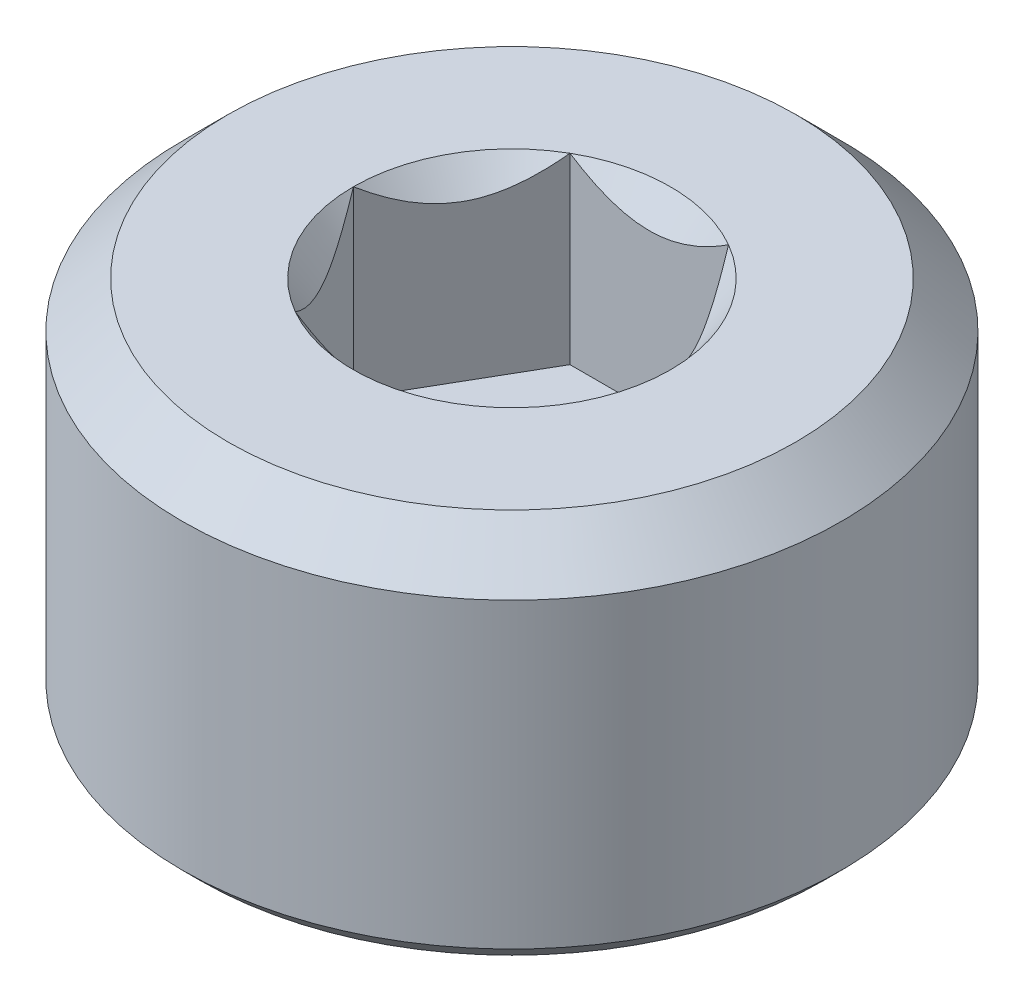
ISO-10303-21;
HEADER;
FILE_DESCRIPTION(('STEP AP214'),'2;1');
FILE_NAME('part.step','',(''),(''),'','','');
FILE_SCHEMA(('AUTOMOTIVE_DESIGN { 1 0 10303 214 1 1 1 1 }'));
ENDSEC;
DATA;
#1=APPLICATION_CONTEXT('core data for automotive mechanical design processes');
#2=APPLICATION_PROTOCOL_DEFINITION('international standard','automotive_design',2000,#1);
#3=PRODUCT_CONTEXT('',#1,'mechanical');
#4=PRODUCT('Part','Part','',(#3));
#5=PRODUCT_RELATED_PRODUCT_CATEGORY('part','',(#4));
#6=PRODUCT_DEFINITION_FORMATION('','',#4);
#7=PRODUCT_DEFINITION_CONTEXT('part definition',#1,'design');
#8=PRODUCT_DEFINITION('design','',#6,#7);
#9=PRODUCT_DEFINITION_SHAPE('','',#8);
#10=(LENGTH_UNIT() NAMED_UNIT(*) SI_UNIT(.MILLI.,.METRE.));
#11=(NAMED_UNIT(*) PLANE_ANGLE_UNIT() SI_UNIT($,.RADIAN.));
#12=(NAMED_UNIT(*) SI_UNIT($,.STERADIAN.) SOLID_ANGLE_UNIT());
#13=UNCERTAINTY_MEASURE_WITH_UNIT(LENGTH_MEASURE(1.E-05),#10,'distance_accuracy_value','');
#14=(GEOMETRIC_REPRESENTATION_CONTEXT(3) GLOBAL_UNCERTAINTY_ASSIGNED_CONTEXT((#13)) GLOBAL_UNIT_ASSIGNED_CONTEXT((#10,
#11,#12)) REPRESENTATION_CONTEXT('',''));
#15=CARTESIAN_POINT('',(0.,0.,0.));
#16=DIRECTION('',(0.,0.,1.));
#17=DIRECTION('',(1.,0.,0.));
#18=AXIS2_PLACEMENT_3D('',#15,#16,#17);
#19=CARTESIAN_POINT('',(0.,4.,0.));
#20=DIRECTION('',(0.,-1.,0.));
#21=DIRECTION('',(0.,0.,-1.));
#22=AXIS2_PLACEMENT_3D('',#19,#20,#21);
#23=CYLINDRICAL_SURFACE('',#22,3.6);
#24=CARTESIAN_POINT('',(0.,0.2,0.));
#25=DIRECTION('',(0.,1.,0.));
#26=DIRECTION('',(0.,0.,1.));
#27=AXIS2_PLACEMENT_3D('',#24,#25,#26);
#28=CIRCLE('',#27,3.6);
#29=CARTESIAN_POINT('',(0.,0.2,3.6));
#30=VERTEX_POINT('',#29);
#31=EDGE_CURVE('E49',#30,#30,#28,.T.);
#32=ORIENTED_EDGE('',*,*,#31,.T.);
#33=EDGE_LOOP('',(#32));
#34=FACE_BOUND('',#33,.T.);
#35=CARTESIAN_POINT('',(0.,3.5,0.));
#36=DIRECTION('',(0.,1.,0.));
#37=DIRECTION('',(0.,0.,1.));
#38=AXIS2_PLACEMENT_3D('',#35,#36,#37);
#39=CIRCLE('',#38,3.6);
#40=CARTESIAN_POINT('',(0.,3.5,3.6));
#41=VERTEX_POINT('',#40);
#42=EDGE_CURVE('E482',#41,#41,#39,.F.);
#43=ORIENTED_EDGE('',*,*,#42,.T.);
#44=EDGE_LOOP('',(#43));
#45=FACE_BOUND('',#44,.T.);
#46=ADVANCED_FACE('F40',(#34,#45),#23,.T.);
#47=CARTESIAN_POINT('',(0.,4.,0.));
#48=DIRECTION('',(0.,1.,0.));
#49=DIRECTION('',(0.,0.,1.));
#50=AXIS2_PLACEMENT_3D('',#47,#48,#49);
#51=PLANE('',#50);
#52=CARTESIAN_POINT('',(0.,4.,0.));
#53=DIRECTION('',(0.,1.,0.));
#54=DIRECTION('',(0.,0.,1.));
#55=AXIS2_PLACEMENT_3D('',#52,#53,#54);
#56=CIRCLE('',#55,3.1);
#57=CARTESIAN_POINT('',(0.,4.,3.1));
#58=VERTEX_POINT('',#57);
#59=EDGE_CURVE('E155',#58,#58,#56,.T.);
#60=ORIENTED_EDGE('',*,*,#59,.T.);
#61=EDGE_LOOP('',(#60));
#62=FACE_BOUND('',#61,.T.);
#63=CARTESIAN_POINT('',(0.,4.,0.));
#64=DIRECTION('',(0.,1.,0.));
#65=DIRECTION('',(0.,0.,1.));
#66=AXIS2_PLACEMENT_3D('',#63,#64,#65);
#67=CIRCLE('',#66,1.73205080756888);
#68=CARTESIAN_POINT('',(0.86602663305117,4.,1.50000212826788));
#69=VERTEX_POINT('',#68);
#70=CARTESIAN_POINT('',(1.73205080756888,4.,0.));
#71=VERTEX_POINT('',#70);
#72=EDGE_CURVE('E126',#69,#71,#67,.T.);
#73=ORIENTED_EDGE('',*,*,#72,.F.);
#74=CARTESIAN_POINT('',(-0.866025403784438,4.,1.5));
#75=VERTEX_POINT('',#74);
#76=EDGE_CURVE('E260',#75,#69,#67,.T.);
#77=ORIENTED_EDGE('',*,*,#76,.F.);
#78=CARTESIAN_POINT('',(-1.73205080756888,4.,0.));
#79=VERTEX_POINT('',#78);
#80=EDGE_CURVE('E257',#79,#75,#67,.T.);
#81=ORIENTED_EDGE('',*,*,#80,.F.);
#82=CARTESIAN_POINT('',(-0.866026633051167,4.,-1.50000212826789));
#83=VERTEX_POINT('',#82);
#84=EDGE_CURVE('E64',#83,#79,#67,.T.);
#85=ORIENTED_EDGE('',*,*,#84,.F.);
#86=CARTESIAN_POINT('',(0.866024628980088,4.,-1.49999865724289));
#87=VERTEX_POINT('',#86);
#88=EDGE_CURVE('E178',#87,#83,#67,.T.);
#89=ORIENTED_EDGE('',*,*,#88,.F.);
#90=EDGE_CURVE('E141',#71,#87,#67,.T.);
#91=ORIENTED_EDGE('',*,*,#90,.F.);
#92=EDGE_LOOP('',(#73,#77,#81,#85,#89,#91));
#93=FACE_BOUND('',#92,.T.);
#94=ADVANCED_FACE('F177',(#62,#93),#51,.T.);
#95=CARTESIAN_POINT('',(0.,0.,0.));
#96=DIRECTION('',(0.,1.,0.));
#97=DIRECTION('',(0.,0.,1.));
#98=AXIS2_PLACEMENT_3D('',#95,#96,#97);
#99=PLANE('',#98);
#100=CARTESIAN_POINT('',(0.,0.,0.));
#101=DIRECTION('',(0.,1.,0.));
#102=DIRECTION('',(0.,0.,1.));
#103=AXIS2_PLACEMENT_3D('',#100,#101,#102);
#104=CIRCLE('',#103,3.4);
#105=CARTESIAN_POINT('',(0.,0.,3.4));
#106=VERTEX_POINT('',#105);
#107=EDGE_CURVE('E12',#106,#106,#104,.F.);
#108=ORIENTED_EDGE('',*,*,#107,.T.);
#109=EDGE_LOOP('',(#108));
#110=FACE_BOUND('',#109,.T.);
#111=ADVANCED_FACE('F198',(#110),#99,.F.);
#112=CARTESIAN_POINT('',(0.,3.7,0.));
#113=DIRECTION('',(0.,1.,0.));
#114=DIRECTION('',(0.,0.,1.));
#115=AXIS2_PLACEMENT_3D('',#112,#113,#114);
#116=CONICAL_SURFACE('',#115,1.5,0.658373937780635);
#117=ORIENTED_EDGE('',*,*,#90,.T.);
#118=CARTESIAN_POINT('',(1.73216627762271,4.00014929695951,0.000200000000000189));
#119=CARTESIAN_POINT('',(1.68470317304455,3.9387948104205,-0.0820085086143397));
#120=CARTESIAN_POINT('',(1.63468238723343,3.8815734535091,-0.168647051073716));
#121=CARTESIAN_POINT('',(1.52986120222608,3.78577671769678,-0.350202669216024));
#122=CARTESIAN_POINT('',(1.47501566024014,3.747405945603,-0.445197934504332));
#123=CARTESIAN_POINT('',(1.38424170870309,3.71052819306535,-0.60242303057029));
#124=CARTESIAN_POINT('',(1.34938951234473,3.70226526358055,-0.662788805418339));
#125=CARTESIAN_POINT('',(1.27977360016166,3.69856750205182,-0.783367102334667));
#126=CARTESIAN_POINT('',(1.24501110944695,3.70303905086789,-0.843577502450194));
#127=CARTESIAN_POINT('',(1.17658203271347,3.72371306708084,-0.962100140067606));
#128=CARTESIAN_POINT('',(1.14291102856452,3.73985975920638,-1.02042002999544));
#129=CARTESIAN_POINT('',(1.07687692082179,3.78157585767296,-1.13479445963833));
#130=CARTESIAN_POINT('',(1.04452372874817,3.8072057638297,-1.19083183209688));
#131=CARTESIAN_POINT('',(0.987325509444635,3.85990139574927,-1.28990205403307));
#132=CARTESIAN_POINT('',(0.962204666115238,3.88580995159191,-1.33341263100856));
#133=CARTESIAN_POINT('',(0.913223874934007,3.94081643100068,-1.41824984992937));
#134=CARTESIAN_POINT('',(0.889352762705577,3.96987432622318,-1.45959582914219));
#135=CARTESIAN_POINT('',(0.8659099337306,4.00014929695951,-1.5002));
#136=B_SPLINE_CURVE_WITH_KNOTS('',3,(#118,#119,#120,#121,#122,#123,#124,#125,#126,#127,#128,
#129,#130,#131,#132,#133,#134,#135),.UNSPECIFIED.,.F.,.F.,(4,2,2,2,2,2,2,2,4),(0.,
0.342302497442157,0.688242536879981,0.897661003376357,1.1055438862815,1.31244016387057,
1.5206797934228,1.6901220695248,1.85761915263013),.UNSPECIFIED.);
#137=CARTESIAN_POINT('',(1.29893397721988,3.70000001869028,-0.75018035577766));
#138=VERTEX_POINT('',#137);
#139=EDGE_CURVE('E156',#138,#87,#136,.T.);
#140=ORIENTED_EDGE('',*,*,#139,.F.);
#141=CARTESIAN_POINT('',(1.29903810567666,3.7,-0.75));
#142=DIRECTION('',(-0.499999997986311,8.97462545794012E-05,-0.866025400296838));
#143=VECTOR('',#142,1.);
#144=LINE('',#141,#143);
#145=CARTESIAN_POINT('',(1.29903669948382,3.7,-0.74999918865121));
#146=VERTEX_POINT('',#145);
#147=EDGE_CURVE('E151',#146,#138,#144,.T.);
#148=ORIENTED_EDGE('',*,*,#147,.F.);
#149=EDGE_CURVE('E146',#71,#146,#136,.T.);
#150=ORIENTED_EDGE('',*,*,#149,.F.);
#151=EDGE_LOOP('',(#117,#140,#148,#150));
#152=FACE_BOUND('',#151,.T.);
#153=ADVANCED_FACE('F147',(#152),#116,.F.);
#154=CARTESIAN_POINT('',(0.,3.7,0.));
#155=DIRECTION('',(0.,1.,0.));
#156=DIRECTION('',(0.,0.,1.));
#157=AXIS2_PLACEMENT_3D('',#154,#155,#156);
#158=CIRCLE('',#157,1.5);
#159=CARTESIAN_POINT('',(0.00053913890151861,3.7,-1.50000000097464));
#160=VERTEX_POINT('',#159);
#161=CARTESIAN_POINT('',(0.,3.7,-1.5));
#162=VERTEX_POINT('',#161);
#163=EDGE_CURVE('E278',#160,#162,#158,.T.);
#164=ORIENTED_EDGE('',*,*,#163,.F.);
#165=CARTESIAN_POINT('',(2.62408205607438,5.66838318386751,-1.5));
#166=CARTESIAN_POINT('',(2.5722518577941,5.61021425048297,-1.5));
#167=CARTESIAN_POINT('',(2.5202152809341,5.55222849979794,-1.5));
#168=CARTESIAN_POINT('',(2.41564440843719,5.43670057582653,-1.5));
#169=CARTESIAN_POINT('',(2.3631100791447,5.37915843301874,-1.5));
#170=CARTESIAN_POINT('',(2.20441944348227,5.20708201281469,-1.5));
#171=CARTESIAN_POINT('',(2.09739478149864,5.09334533018313,-1.5));
#172=CARTESIAN_POINT('',(1.87931703740767,4.86823460080757,-1.5));
#173=CARTESIAN_POINT('',(1.7682412605443,4.75688226216544,-1.5));
#174=CARTESIAN_POINT('',(1.59794242933439,4.59378413765201,-1.5));
#175=CARTESIAN_POINT('',(1.54058532514464,4.54009357922808,-1.5));
#176=CARTESIAN_POINT('',(1.42431632730804,4.43442637655795,-1.5));
#177=CARTESIAN_POINT('',(1.36540464039697,4.38244950646472,-1.5));
#178=CARTESIAN_POINT('',(1.26432245495508,4.29665878446898,-1.5));
#179=CARTESIAN_POINT('',(1.22266635596937,4.26223981114632,-1.5));
#180=CARTESIAN_POINT('',(1.13826254091543,4.19475577603005,-1.5));
#181=CARTESIAN_POINT('',(1.09551476289084,4.16169079135822,-1.5));
#182=CARTESIAN_POINT('',(1.00857689922031,4.09714866220247,-1.5));
#183=CARTESIAN_POINT('',(0.964381943801944,4.06567803931122,-1.5));
#184=CARTESIAN_POINT('',(0.874499239551919,4.00495090754076,-1.5));
#185=CARTESIAN_POINT('',(0.828811821402204,3.97569391289289,-1.5));
#186=CARTESIAN_POINT('',(0.734790424168225,3.91948728482412,-1.5));
#187=CARTESIAN_POINT('',(0.686421995378124,3.89259463826985,-1.5));
#188=CARTESIAN_POINT('',(0.58768073652831,3.84269342313155,-1.5));
#189=CARTESIAN_POINT('',(0.537307497760848,3.81968565159603,-1.5));
#190=CARTESIAN_POINT('',(0.434884122639641,3.77888404103877,-1.5));
#191=CARTESIAN_POINT('',(0.382849261305249,3.76105266272078,-1.5));
#192=CARTESIAN_POINT('',(0.277067712113839,3.7316740192231,-1.5));
#193=CARTESIAN_POINT('',(0.223323088579574,3.72011945922177,-1.5));
#194=CARTESIAN_POINT('',(0.100017901343093,3.7023007127275,-1.5));
#195=CARTESIAN_POINT('',(0.0301036556746294,3.69830606573399,-1.5));
#196=CARTESIAN_POINT('',(-0.109289178624825,3.70304476598226,-1.5));
#197=CARTESIAN_POINT('',(-0.178767462038265,3.71178620643723,-1.5));
#198=CARTESIAN_POINT('',(-0.334483117238332,3.74448727495287,-1.5));
#199=CARTESIAN_POINT('',(-0.419949890691741,3.77203012360789,-1.5));
#200=CARTESIAN_POINT('',(-0.544092564146134,3.82299874608893,-1.5));
#201=CARTESIAN_POINT('',(-0.584897030701747,3.84165797074686,-1.5));
#202=CARTESIAN_POINT('',(-0.665205165020233,3.88159792668045,-1.5));
#203=CARTESIAN_POINT('',(-0.704709071800037,3.90287817281779,-1.5));
#204=CARTESIAN_POINT('',(-0.801120001904702,3.9582327421369,-1.5));
#205=CARTESIAN_POINT('',(-0.85730440538045,3.99355476228028,-1.5));
#206=CARTESIAN_POINT('',(-0.967438802487129,4.06754896703432,-1.5));
#207=CARTESIAN_POINT('',(-1.02138739805114,4.10622320244691,-1.5));
#208=CARTESIAN_POINT('',(-1.12752392819885,4.18612409736657,-1.5));
#209=CARTESIAN_POINT('',(-1.17970793485625,4.2273559375397,-1.5));
#210=CARTESIAN_POINT('',(-1.28253828825219,4.31170128974672,-1.5));
#211=CARTESIAN_POINT('',(-1.33318434347537,4.35481515478571,-1.5));
#212=CARTESIAN_POINT('',(-1.4837612192679,4.48676392960844,-1.5));
#213=CARTESIAN_POINT('',(-1.58177938806796,4.57777617888057,-1.5));
#214=CARTESIAN_POINT('',(-1.77434660705591,4.76340494746786,-1.5));
#215=CARTESIAN_POINT('',(-1.86889453960376,4.85802260830462,-1.5));
#216=CARTESIAN_POINT('',(-2.01918192519602,5.0123882851831,-1.5));
#217=CARTESIAN_POINT('',(-2.07570527444122,5.07137680595849,-1.5));
#218=CARTESIAN_POINT('',(-2.18797031248278,5.19007605649345,-1.5));
#219=CARTESIAN_POINT('',(-2.24371211488562,5.24978667888728,-1.5));
#220=CARTESIAN_POINT('',(-2.35386305315381,5.36905301929963,-1.5));
#221=CARTESIAN_POINT('',(-2.40828014049012,5.4286014079688,-1.5));
#222=CARTESIAN_POINT('',(-2.51656519131121,5.54816304752033,-1.5));
#223=CARTESIAN_POINT('',(-2.57043331504846,5.60817615318445,-1.5));
#224=CARTESIAN_POINT('',(-2.62408205607438,5.66838318386751,-1.5));
#225=B_SPLINE_CURVE_WITH_KNOTS('',3,(#165,#166,#167,#168,#169,#170,#171,#172,#173,#174,#175,
#176,#177,#178,#179,#180,#181,#182,#183,#184,#185,#186,#187,#188,#189,#190,#191,#192,#193,#194,
#195,#196,#197,#198,#199,#200,#201,#202,#203,#204,#205,#206,#207,#208,#209,#210,#211,#212,#213,
#214,#215,#216,#217,#218,#219,#220,#221,#222,#223,#224),.UNSPECIFIED.,.F.,.F.,(4,2,2,2,2,2,2,2,
2,2,2,2,2,2,2,2,2,2,2,2,2,2,2,2,2,2,2,2,2,4),(0.,0.233730546533873,0.46747701119278,
0.935961988573748,1.40767842933203,1.64335066559987,1.87899171744796,2.04107804074456,
2.20317358350466,2.36588600071158,2.52856260737632,2.69445228493054,2.86037595634147,
3.02506443351466,3.18956110055608,3.39845490568512,3.60748151138069,3.87518665338576,
4.00973416267058,4.14425680518656,4.34318219400574,4.54223015116976,4.74169537026261,
4.94119816450207,5.34229740847603,5.74352471858722,5.98861095972509,6.23366119759544,
6.47566007927547,6.71758616783575),.UNSPECIFIED.);
#226=EDGE_CURVE('E166',#87,#160,#225,.T.);
#227=ORIENTED_EDGE('',*,*,#226,.F.);
#228=ORIENTED_EDGE('',*,*,#88,.T.);
#229=EDGE_CURVE('E165',#162,#83,#225,.T.);
#230=ORIENTED_EDGE('',*,*,#229,.F.);
#231=EDGE_LOOP('',(#164,#227,#228,#230));
#232=FACE_BOUND('',#231,.T.);
#233=ADVANCED_FACE('F404',(#232),#116,.F.);
#234=CARTESIAN_POINT('',(-1.29904017043426,3.7,-0.750001192676911));
#235=VERTEX_POINT('',#234);
#236=CARTESIAN_POINT('',(-1.29911967584827,3.7,-0.749863485329857));
#237=VERTEX_POINT('',#236);
#238=EDGE_CURVE('E281',#235,#237,#158,.T.);
#239=ORIENTED_EDGE('',*,*,#238,.F.);
#240=CARTESIAN_POINT('',(-0.865909933730601,4.00014929695951,-1.5002));
#241=CARTESIAN_POINT('',(-0.913373038308768,3.9387948104205,-1.41799149138566));
#242=CARTESIAN_POINT('',(-0.963393824119885,3.8815734535091,-1.33135294892628));
#243=CARTESIAN_POINT('',(-1.06821500912724,3.78577671769678,-1.14979733078398));
#244=CARTESIAN_POINT('',(-1.12306055111318,3.747405945603,-1.05480206549567));
#245=CARTESIAN_POINT('',(-1.21383450265023,3.71052819306535,-0.897576969429711));
#246=CARTESIAN_POINT('',(-1.24868669900859,3.70226526358055,-0.837211194581662));
#247=CARTESIAN_POINT('',(-1.31830261119166,3.69856750205182,-0.716632897665334));
#248=CARTESIAN_POINT('',(-1.35306510190637,3.70303905086789,-0.656422497549807));
#249=CARTESIAN_POINT('',(-1.42149417863985,3.72371306708084,-0.537899859932395));
#250=CARTESIAN_POINT('',(-1.45516518278879,3.73985975920638,-0.479579970004557));
#251=CARTESIAN_POINT('',(-1.52119929053152,3.78157585767296,-0.365205540361671));
#252=CARTESIAN_POINT('',(-1.55355248260515,3.8072057638297,-0.309168167903123));
#253=CARTESIAN_POINT('',(-1.61075070190868,3.85990139574927,-0.210097945966935));
#254=CARTESIAN_POINT('',(-1.63587154523808,3.88580995159191,-0.166587368991442));
#255=CARTESIAN_POINT('',(-1.68485233641931,3.94081643100068,-0.0817501500706291));
#256=CARTESIAN_POINT('',(-1.70872344864774,3.96987432622318,-0.0404041708578081));
#257=CARTESIAN_POINT('',(-1.73216627762272,4.00014929695951,0.000199999999999275));
#258=B_SPLINE_CURVE_WITH_KNOTS('',3,(#240,#241,#242,#243,#244,#245,#246,#247,#248,#249,#250,
#251,#252,#253,#254,#255,#256,#257),.UNSPECIFIED.,.F.,.F.,(4,2,2,2,2,2,2,2,4),(0.,
0.342302497442156,0.688242536879979,0.897661003376355,1.1055438862815,1.31244016387056,
1.5206797934228,1.6901220695248,1.85761915263013),.UNSPECIFIED.);
#259=EDGE_CURVE('E507',#83,#235,#258,.T.);
#260=ORIENTED_EDGE('',*,*,#259,.F.);
#261=ORIENTED_EDGE('',*,*,#84,.T.);
#262=EDGE_CURVE('E508',#237,#79,#258,.T.);
#263=ORIENTED_EDGE('',*,*,#262,.F.);
#264=EDGE_LOOP('',(#239,#260,#261,#263));
#265=FACE_BOUND('',#264,.T.);
#266=ADVANCED_FACE('F499',(#265),#116,.F.);
#267=CARTESIAN_POINT('',(-1.29903669948382,3.7,0.749999188651212));
#268=VERTEX_POINT('',#267);
#269=CARTESIAN_POINT('',(-1.29893257109793,3.7,0.750179544208477));
#270=VERTEX_POINT('',#269);
#271=EDGE_CURVE('E140',#268,#270,#158,.T.);
#272=ORIENTED_EDGE('',*,*,#271,.F.);
#273=CARTESIAN_POINT('',(-1.73216627762272,4.00014929695951,-0.000200000000000306));
#274=CARTESIAN_POINT('',(-1.68470317304455,3.9387948104205,0.0820085086143396));
#275=CARTESIAN_POINT('',(-1.63468238723343,3.8815734535091,0.168647051073716));
#276=CARTESIAN_POINT('',(-1.52986120222608,3.78577671769678,0.350202669216023));
#277=CARTESIAN_POINT('',(-1.47501566024014,3.747405945603,0.445197934504331));
#278=CARTESIAN_POINT('',(-1.38424170870309,3.71052819306535,0.60242303057029));
#279=CARTESIAN_POINT('',(-1.34938951234473,3.70226526358055,0.662788805418338));
#280=CARTESIAN_POINT('',(-1.27977360016166,3.69856750205182,0.783367102334666));
#281=CARTESIAN_POINT('',(-1.24501110944695,3.70303905086789,0.843577502450193));
#282=CARTESIAN_POINT('',(-1.17658203271347,3.72371306708084,0.962100140067605));
#283=CARTESIAN_POINT('',(-1.14291102856452,3.73985975920638,1.02042002999544));
#284=CARTESIAN_POINT('',(-1.07687692082179,3.78157585767296,1.13479445963833));
#285=CARTESIAN_POINT('',(-1.04452372874817,3.8072057638297,1.19083183209688));
#286=CARTESIAN_POINT('',(-0.987325509444635,3.85990139574927,1.28990205403306));
#287=CARTESIAN_POINT('',(-0.962204666115238,3.88580995159191,1.33341263100856));
#288=CARTESIAN_POINT('',(-0.913223874934008,3.94081643100068,1.41824984992937));
#289=CARTESIAN_POINT('',(-0.889352762705577,3.96987432622318,1.45959582914219));
#290=CARTESIAN_POINT('',(-0.8659099337306,4.00014929695951,1.5002));
#291=B_SPLINE_CURVE_WITH_KNOTS('',3,(#273,#274,#275,#276,#277,#278,#279,#280,#281,#282,#283,
#284,#285,#286,#287,#288,#289,#290),.UNSPECIFIED.,.F.,.F.,(4,2,2,2,2,2,2,2,4),(0.,
0.342302497442156,0.68824253687998,0.897661003376356,1.1055438862815,1.31244016387056,
1.5206797934228,1.6901220695248,1.85761915263013),.UNSPECIFIED.);
#292=EDGE_CURVE('E509',#79,#268,#291,.T.);
#293=ORIENTED_EDGE('',*,*,#292,.F.);
#294=ORIENTED_EDGE('',*,*,#80,.T.);
#295=EDGE_CURVE('E526',#270,#75,#291,.T.);
#296=ORIENTED_EDGE('',*,*,#295,.F.);
#297=EDGE_LOOP('',(#272,#293,#294,#296));
#298=FACE_BOUND('',#297,.T.);
#299=ADVANCED_FACE('F503',(#298),#116,.F.);
#300=CARTESIAN_POINT('',(-2.62408205607438,5.66838318386751,1.5));
#301=CARTESIAN_POINT('',(-2.5722518577941,5.61021425048297,1.5));
#302=CARTESIAN_POINT('',(-2.5202152809341,5.55222849979795,1.5));
#303=CARTESIAN_POINT('',(-2.41564440843719,5.43670057582653,1.5));
#304=CARTESIAN_POINT('',(-2.3631100791447,5.37915843301874,1.5));
#305=CARTESIAN_POINT('',(-2.20441944348227,5.20708201281469,1.5));
#306=CARTESIAN_POINT('',(-2.09739478149864,5.09334533018314,1.5));
#307=CARTESIAN_POINT('',(-1.87931703740767,4.86823460080757,1.5));
#308=CARTESIAN_POINT('',(-1.76824126054431,4.75688226216544,1.5));
#309=CARTESIAN_POINT('',(-1.5979424293344,4.59378413765201,1.5));
#310=CARTESIAN_POINT('',(-1.54058532514464,4.54009357922808,1.5));
#311=CARTESIAN_POINT('',(-1.42431632730804,4.43442637655795,1.5));
#312=CARTESIAN_POINT('',(-1.36540464039697,4.38244950646472,1.5));
#313=CARTESIAN_POINT('',(-1.26432245495508,4.29665878446898,1.5));
#314=CARTESIAN_POINT('',(-1.22266635596937,4.26223981114632,1.5));
#315=CARTESIAN_POINT('',(-1.13826254091543,4.19475577603005,1.5));
#316=CARTESIAN_POINT('',(-1.09551476289084,4.16169079135822,1.5));
#317=CARTESIAN_POINT('',(-1.00857689922032,4.09714866220247,1.5));
#318=CARTESIAN_POINT('',(-0.964381943801944,4.06567803931122,1.5));
#319=CARTESIAN_POINT('',(-0.874499239551919,4.00495090754076,1.5));
#320=CARTESIAN_POINT('',(-0.828811821402205,3.97569391289289,1.5));
#321=CARTESIAN_POINT('',(-0.734790424168226,3.91948728482412,1.5));
#322=CARTESIAN_POINT('',(-0.686421995378125,3.89259463826985,1.5));
#323=CARTESIAN_POINT('',(-0.587680736528311,3.84269342313155,1.5));
#324=CARTESIAN_POINT('',(-0.537307497760849,3.81968565159603,1.5));
#325=CARTESIAN_POINT('',(-0.434884122639642,3.77888404103877,1.5));
#326=CARTESIAN_POINT('',(-0.38284926130525,3.76105266272078,1.5));
#327=CARTESIAN_POINT('',(-0.27706771211384,3.7316740192231,1.5));
#328=CARTESIAN_POINT('',(-0.223323088579575,3.72011945922177,1.5));
#329=CARTESIAN_POINT('',(-0.100017901343094,3.7023007127275,1.5));
#330=CARTESIAN_POINT('',(-0.0301036556746304,3.69830606573399,1.5));
#331=CARTESIAN_POINT('',(0.109289178624824,3.70304476598226,1.5));
#332=CARTESIAN_POINT('',(0.178767462038264,3.71178620643723,1.5));
#333=CARTESIAN_POINT('',(0.334483117238331,3.74448727495287,1.5));
#334=CARTESIAN_POINT('',(0.419949890691741,3.77203012360789,1.5));
#335=CARTESIAN_POINT('',(0.544092564146134,3.82299874608893,1.5));
#336=CARTESIAN_POINT('',(0.584897030701747,3.84165797074686,1.5));
#337=CARTESIAN_POINT('',(0.665205165020232,3.88159792668045,1.5));
#338=CARTESIAN_POINT('',(0.704709071800036,3.90287817281778,1.5));
#339=CARTESIAN_POINT('',(0.8011200019047,3.9582327421369,1.5));
#340=CARTESIAN_POINT('',(0.857304405380449,3.99355476228028,1.5));
#341=CARTESIAN_POINT('',(0.967438802487128,4.06754896703432,1.5));
#342=CARTESIAN_POINT('',(1.02138739805114,4.10622320244691,1.5));
#343=CARTESIAN_POINT('',(1.12752392819885,4.18612409736657,1.5));
#344=CARTESIAN_POINT('',(1.17970793485625,4.2273559375397,1.5));
#345=CARTESIAN_POINT('',(1.28253828825219,4.31170128974672,1.5));
#346=CARTESIAN_POINT('',(1.33318434347537,4.35481515478571,1.5));
#347=CARTESIAN_POINT('',(1.4837612192679,4.48676392960844,1.5));
#348=CARTESIAN_POINT('',(1.58177938806796,4.57777617888057,1.5));
#349=CARTESIAN_POINT('',(1.77434660705591,4.76340494746785,1.5));
#350=CARTESIAN_POINT('',(1.86889453960375,4.85802260830462,1.5));
#351=CARTESIAN_POINT('',(2.01918192519601,5.0123882851831,1.5));
#352=CARTESIAN_POINT('',(2.07570527444121,5.07137680595849,1.5));
#353=CARTESIAN_POINT('',(2.18797031248278,5.19007605649345,1.5));
#354=CARTESIAN_POINT('',(2.24371211488562,5.24978667888728,1.5));
#355=CARTESIAN_POINT('',(2.35386305315381,5.36905301929963,1.5));
#356=CARTESIAN_POINT('',(2.40828014049012,5.4286014079688,1.5));
#357=CARTESIAN_POINT('',(2.51656519131121,5.54816304752033,1.5));
#358=CARTESIAN_POINT('',(2.57043331504846,5.60817615318445,1.5));
#359=CARTESIAN_POINT('',(2.62408205607438,5.66838318386751,1.5));
#360=B_SPLINE_CURVE_WITH_KNOTS('',3,(#300,#301,#302,#303,#304,#305,#306,#307,#308,#309,#310,
#311,#312,#313,#314,#315,#316,#317,#318,#319,#320,#321,#322,#323,#324,#325,#326,#327,#328,#329,
#330,#331,#332,#333,#334,#335,#336,#337,#338,#339,#340,#341,#342,#343,#344,#345,#346,#347,#348,
#349,#350,#351,#352,#353,#354,#355,#356,#357,#358,#359),.UNSPECIFIED.,.F.,.F.,(4,2,2,2,2,2,2,2,
2,2,2,2,2,2,2,2,2,2,2,2,2,2,2,2,2,2,2,2,2,4),(0.,0.233730546533872,0.46747701119278,
0.935961988573748,1.40767842933203,1.64335066559987,1.87899171744796,2.04107804074456,
2.20317358350466,2.36588600071158,2.52856260737632,2.69445228493054,2.86037595634147,
3.02506443351466,3.18956110055608,3.39845490568511,3.60748151138069,3.87518665338576,
4.00973416267058,4.14425680518655,4.34318219400574,4.54223015116976,4.74169537026261,
4.94119816450207,5.34229740847602,5.74352471858722,5.98861095972509,6.23366119759544,
6.47566007927547,6.71758616783575),.UNSPECIFIED.);
#361=EDGE_CURVE('E56',#75,#69,#360,.T.);
#362=ORIENTED_EDGE('',*,*,#361,.F.);
#363=ORIENTED_EDGE('',*,*,#76,.T.);
#364=EDGE_LOOP('',(#362,#363));
#365=FACE_BOUND('',#364,.T.);
#366=ADVANCED_FACE('F303',(#365),#116,.F.);
#367=ORIENTED_EDGE('',*,*,#72,.T.);
#368=CARTESIAN_POINT('',(0.865909933730601,4.00014929695951,1.5002));
#369=CARTESIAN_POINT('',(0.913373038308768,3.9387948104205,1.41799149138566));
#370=CARTESIAN_POINT('',(0.963393824119885,3.8815734535091,1.33135294892628));
#371=CARTESIAN_POINT('',(1.06821500912724,3.78577671769678,1.14979733078398));
#372=CARTESIAN_POINT('',(1.12306055111318,3.747405945603,1.05480206549567));
#373=CARTESIAN_POINT('',(1.21383450265023,3.71052819306535,0.89757696942971));
#374=CARTESIAN_POINT('',(1.24868669900859,3.70226526358055,0.837211194581662));
#375=CARTESIAN_POINT('',(1.31830261119166,3.69856750205182,0.716632897665333));
#376=CARTESIAN_POINT('',(1.35306510190637,3.70303905086789,0.656422497549807));
#377=CARTESIAN_POINT('',(1.42149417863985,3.72371306708084,0.537899859932394));
#378=CARTESIAN_POINT('',(1.45516518278879,3.73985975920638,0.479579970004556));
#379=CARTESIAN_POINT('',(1.52119929053152,3.78157585767296,0.36520554036167));
#380=CARTESIAN_POINT('',(1.55355248260515,3.8072057638297,0.309168167903122));
#381=CARTESIAN_POINT('',(1.61075070190868,3.85990139574927,0.210097945966935));
#382=CARTESIAN_POINT('',(1.63587154523808,3.88580995159192,0.166587368991441));
#383=CARTESIAN_POINT('',(1.68485233641931,3.94081643100068,0.0817501500706283));
#384=CARTESIAN_POINT('',(1.70872344864774,3.96987432622318,0.0404041708578074));
#385=CARTESIAN_POINT('',(1.73216627762271,4.00014929695951,-0.000199999999999753));
#386=B_SPLINE_CURVE_WITH_KNOTS('',3,(#368,#369,#370,#371,#372,#373,#374,#375,#376,#377,#378,
#379,#380,#381,#382,#383,#384,#385),.UNSPECIFIED.,.F.,.F.,(4,2,2,2,2,2,2,2,4),(0.,
0.342302497442156,0.688242536879979,0.897661003376355,1.1055438862815,1.31244016387056,
1.5206797934228,1.6901220695248,1.85761915263013),.UNSPECIFIED.);
#387=CARTESIAN_POINT('',(1.29911967584833,3.7,0.749863485329758));
#388=VERTEX_POINT('',#387);
#389=EDGE_CURVE('E131',#388,#71,#386,.T.);
#390=ORIENTED_EDGE('',*,*,#389,.F.);
#391=CARTESIAN_POINT('',(1.29904017043426,3.7,0.750001192676912));
#392=VERTEX_POINT('',#391);
#393=EDGE_CURVE('E163',#392,#388,#158,.T.);
#394=ORIENTED_EDGE('',*,*,#393,.F.);
#395=EDGE_CURVE('E134',#69,#392,#386,.T.);
#396=ORIENTED_EDGE('',*,*,#395,.F.);
#397=EDGE_LOOP('',(#367,#390,#394,#396));
#398=FACE_BOUND('',#397,.T.);
#399=ADVANCED_FACE('F129',(#398),#116,.F.);
#400=CARTESIAN_POINT('',(0.,2.,0.));
#401=DIRECTION('',(0.,1.,0.));
#402=DIRECTION('',(0.,0.,1.));
#403=AXIS2_PLACEMENT_3D('',#400,#401,#402);
#404=PLANE('',#403);
#405=DIRECTION('',(0.5,0.,-0.866025403784439));
#406=VECTOR('',#405,1.);
#407=CARTESIAN_POINT('',(0.866025403784439,2.,1.5));
#408=LINE('',#407,#406);
#409=CARTESIAN_POINT('',(0.866025403784439,2.,1.5));
#410=VERTEX_POINT('',#409);
#411=CARTESIAN_POINT('',(1.73205080756888,2.,0.));
#412=VERTEX_POINT('',#411);
#413=EDGE_CURVE('E519',#410,#412,#408,.T.);
#414=ORIENTED_EDGE('',*,*,#413,.T.);
#415=DIRECTION('',(-0.5,0.,-0.866025403784438));
#416=VECTOR('',#415,1.);
#417=CARTESIAN_POINT('',(1.73205080756888,2.,0.));
#418=LINE('',#417,#416);
#419=CARTESIAN_POINT('',(0.866025403784438,2.,-1.5));
#420=VERTEX_POINT('',#419);
#421=EDGE_CURVE('E170',#412,#420,#418,.T.);
#422=ORIENTED_EDGE('',*,*,#421,.T.);
#423=DIRECTION('',(-1.,0.,0.));
#424=VECTOR('',#423,1.);
#425=CARTESIAN_POINT('',(0.866025403784438,2.,-1.5));
#426=LINE('',#425,#424);
#427=CARTESIAN_POINT('',(-0.866025403784439,2.,-1.5));
#428=VERTEX_POINT('',#427);
#429=EDGE_CURVE('E511',#420,#428,#426,.T.);
#430=ORIENTED_EDGE('',*,*,#429,.T.);
#431=DIRECTION('',(-0.5,0.,0.866025403784438));
#432=VECTOR('',#431,1.);
#433=CARTESIAN_POINT('',(-0.866025403784439,2.,-1.5));
#434=LINE('',#433,#432);
#435=CARTESIAN_POINT('',(-1.73205080756888,2.,0.));
#436=VERTEX_POINT('',#435);
#437=EDGE_CURVE('E513',#428,#436,#434,.T.);
#438=ORIENTED_EDGE('',*,*,#437,.T.);
#439=DIRECTION('',(0.5,0.,0.866025403784438));
#440=VECTOR('',#439,1.);
#441=CARTESIAN_POINT('',(-1.73205080756888,2.,0.));
#442=LINE('',#441,#440);
#443=CARTESIAN_POINT('',(-0.866025403784438,2.,1.5));
#444=VERTEX_POINT('',#443);
#445=EDGE_CURVE('E516',#436,#444,#442,.T.);
#446=ORIENTED_EDGE('',*,*,#445,.T.);
#447=DIRECTION('',(1.,0.,0.));
#448=VECTOR('',#447,1.);
#449=CARTESIAN_POINT('',(-0.866025403784438,2.,1.5));
#450=LINE('',#449,#448);
#451=EDGE_CURVE('E173',#444,#410,#450,.T.);
#452=ORIENTED_EDGE('',*,*,#451,.T.);
#453=EDGE_LOOP('',(#414,#422,#430,#438,#446,#452));
#454=FACE_BOUND('',#453,.T.);
#455=ADVANCED_FACE('F302',(#454),#404,.T.);
#456=CARTESIAN_POINT('',(1.73205080756888,2.,0.));
#457=DIRECTION('',(0.866025403784439,0.,-0.5));
#458=DIRECTION('',(-0.5,0.,-0.866025403784439));
#459=AXIS2_PLACEMENT_3D('',#456,#457,#458);
#460=PLANE('',#459);
#461=DIRECTION('',(0.,1.,0.));
#462=VECTOR('',#461,1.);
#463=CARTESIAN_POINT('',(1.73205080756888,2.,0.));
#464=LINE('',#463,#462);
#465=EDGE_CURVE('E161',#412,#71,#464,.T.);
#466=ORIENTED_EDGE('',*,*,#465,.T.);
#467=ORIENTED_EDGE('',*,*,#149,.T.);
#468=ORIENTED_EDGE('',*,*,#147,.T.);
#469=ORIENTED_EDGE('',*,*,#139,.T.);
#470=DIRECTION('',(0.,1.,0.));
#471=VECTOR('',#470,1.);
#472=CARTESIAN_POINT('',(0.866025403784438,2.,-1.5));
#473=LINE('',#472,#471);
#474=EDGE_CURVE('E172',#420,#87,#473,.T.);
#475=ORIENTED_EDGE('',*,*,#474,.F.);
#476=ORIENTED_EDGE('',*,*,#421,.F.);
#477=EDGE_LOOP('',(#466,#467,#468,#469,#475,#476));
#478=FACE_BOUND('',#477,.T.);
#479=ADVANCED_FACE('F168',(#478),#460,.F.);
#480=CARTESIAN_POINT('',(0.866025403784438,2.,-1.5));
#481=DIRECTION('',(0.,0.,-1.));
#482=DIRECTION('',(-1.,0.,0.));
#483=AXIS2_PLACEMENT_3D('',#480,#481,#482);
#484=PLANE('',#483);
#485=ORIENTED_EDGE('',*,*,#474,.T.);
#486=ORIENTED_EDGE('',*,*,#226,.T.);
#487=ORIENTED_EDGE('',*,*,#163,.T.);
#488=ORIENTED_EDGE('',*,*,#229,.T.);
#489=DIRECTION('',(0.,1.,0.));
#490=VECTOR('',#489,1.);
#491=CARTESIAN_POINT('',(-0.866025403784439,2.,-1.5));
#492=LINE('',#491,#490);
#493=EDGE_CURVE('E237',#428,#83,#492,.T.);
#494=ORIENTED_EDGE('',*,*,#493,.F.);
#495=ORIENTED_EDGE('',*,*,#429,.F.);
#496=EDGE_LOOP('',(#485,#486,#487,#488,#494,#495));
#497=FACE_BOUND('',#496,.T.);
#498=ADVANCED_FACE('F399',(#497),#484,.F.);
#499=CARTESIAN_POINT('',(-0.866025403784439,2.,-1.5));
#500=DIRECTION('',(-0.866025403784439,0.,-0.5));
#501=DIRECTION('',(-0.5,0.,0.866025403784438));
#502=AXIS2_PLACEMENT_3D('',#499,#500,#501);
#503=PLANE('',#502);
#504=ORIENTED_EDGE('',*,*,#493,.T.);
#505=ORIENTED_EDGE('',*,*,#259,.T.);
#506=ORIENTED_EDGE('',*,*,#238,.T.);
#507=ORIENTED_EDGE('',*,*,#262,.T.);
#508=DIRECTION('',(0.,1.,0.));
#509=VECTOR('',#508,1.);
#510=CARTESIAN_POINT('',(-1.73205080756888,2.,0.));
#511=LINE('',#510,#509);
#512=EDGE_CURVE('E242',#436,#79,#511,.T.);
#513=ORIENTED_EDGE('',*,*,#512,.F.);
#514=ORIENTED_EDGE('',*,*,#437,.F.);
#515=EDGE_LOOP('',(#504,#505,#506,#507,#513,#514));
#516=FACE_BOUND('',#515,.T.);
#517=ADVANCED_FACE('F421',(#516),#503,.F.);
#518=CARTESIAN_POINT('',(-1.73205080756888,2.,0.));
#519=DIRECTION('',(-0.866025403784439,0.,0.5));
#520=DIRECTION('',(0.5,0.,0.866025403784439));
#521=AXIS2_PLACEMENT_3D('',#518,#519,#520);
#522=PLANE('',#521);
#523=ORIENTED_EDGE('',*,*,#512,.T.);
#524=ORIENTED_EDGE('',*,*,#292,.T.);
#525=ORIENTED_EDGE('',*,*,#271,.T.);
#526=ORIENTED_EDGE('',*,*,#295,.T.);
#527=DIRECTION('',(0.,1.,0.));
#528=VECTOR('',#527,1.);
#529=CARTESIAN_POINT('',(-0.866025403784438,2.,1.5));
#530=LINE('',#529,#528);
#531=EDGE_CURVE('E247',#444,#75,#530,.T.);
#532=ORIENTED_EDGE('',*,*,#531,.F.);
#533=ORIENTED_EDGE('',*,*,#445,.F.);
#534=EDGE_LOOP('',(#523,#524,#525,#526,#532,#533));
#535=FACE_BOUND('',#534,.T.);
#536=ADVANCED_FACE('F448',(#535),#522,.F.);
#537=CARTESIAN_POINT('',(-0.866025403784438,2.,1.5));
#538=DIRECTION('',(0.,0.,1.));
#539=DIRECTION('',(1.,0.,0.));
#540=AXIS2_PLACEMENT_3D('',#537,#538,#539);
#541=PLANE('',#540);
#542=ORIENTED_EDGE('',*,*,#531,.T.);
#543=ORIENTED_EDGE('',*,*,#361,.T.);
#544=DIRECTION('',(0.,1.,0.));
#545=VECTOR('',#544,1.);
#546=CARTESIAN_POINT('',(0.866025403784439,2.,1.5));
#547=LINE('',#546,#545);
#548=EDGE_CURVE('E253',#410,#69,#547,.T.);
#549=ORIENTED_EDGE('',*,*,#548,.F.);
#550=ORIENTED_EDGE('',*,*,#451,.F.);
#551=EDGE_LOOP('',(#542,#543,#549,#550));
#552=FACE_BOUND('',#551,.T.);
#553=ADVANCED_FACE('F456',(#552),#541,.F.);
#554=CARTESIAN_POINT('',(0.866025403784439,2.,1.5));
#555=DIRECTION('',(0.866025403784439,0.,0.5));
#556=DIRECTION('',(0.5,0.,-0.866025403784439));
#557=AXIS2_PLACEMENT_3D('',#554,#555,#556);
#558=PLANE('',#557);
#559=ORIENTED_EDGE('',*,*,#548,.T.);
#560=ORIENTED_EDGE('',*,*,#395,.T.);
#561=ORIENTED_EDGE('',*,*,#393,.T.);
#562=ORIENTED_EDGE('',*,*,#389,.T.);
#563=ORIENTED_EDGE('',*,*,#465,.F.);
#564=ORIENTED_EDGE('',*,*,#413,.F.);
#565=EDGE_LOOP('',(#559,#560,#561,#562,#563,#564));
#566=FACE_BOUND('',#565,.T.);
#567=ADVANCED_FACE('F159',(#566),#558,.F.);
#568=CARTESIAN_POINT('',(0.,4.,0.));
#569=DIRECTION('',(0.,-1.,0.));
#570=DIRECTION('',(0.,0.,-1.));
#571=AXIS2_PLACEMENT_3D('',#568,#569,#570);
#572=CONICAL_SURFACE('',#571,3.1,0.785398163397448);
#573=ORIENTED_EDGE('',*,*,#42,.F.);
#574=EDGE_LOOP('',(#573));
#575=FACE_BOUND('',#574,.T.);
#576=ORIENTED_EDGE('',*,*,#59,.F.);
#577=EDGE_LOOP('',(#576));
#578=FACE_BOUND('',#577,.T.);
#579=ADVANCED_FACE('F463',(#575,#578),#572,.T.);
#580=CARTESIAN_POINT('',(0.,0.2,0.));
#581=DIRECTION('',(0.,1.,0.));
#582=DIRECTION('',(0.,0.,1.));
#583=AXIS2_PLACEMENT_3D('',#580,#581,#582);
#584=CONICAL_SURFACE('',#583,3.6,0.785398163397449);
#585=ORIENTED_EDGE('',*,*,#107,.F.);
#586=EDGE_LOOP('',(#585));
#587=FACE_BOUND('',#586,.T.);
#588=ORIENTED_EDGE('',*,*,#31,.F.);
#589=EDGE_LOOP('',(#588));
#590=FACE_BOUND('',#589,.T.);
#591=ADVANCED_FACE('F43',(#587,#590),#584,.T.);
#592=CLOSED_SHELL('',(#46,#94,#111,#153,#233,#266,#299,#366,#399,#455,#479,#498,#517,#536,#553,
#567,#579,#591));
#593=MANIFOLD_SOLID_BREP('B2',#592);
#594=ADVANCED_BREP_SHAPE_REPRESENTATION('',(#18,#593),#14);
#595=SHAPE_DEFINITION_REPRESENTATION(#9,#594);
ENDSEC;
END-ISO-10303-21;
